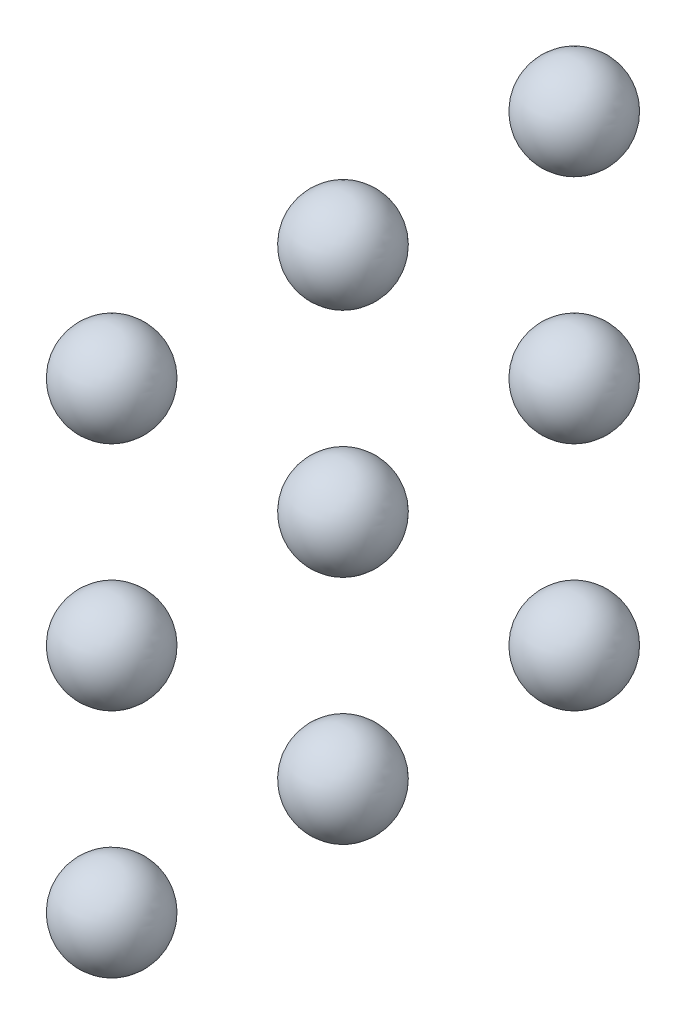
ISO-10303-21;
HEADER;
FILE_DESCRIPTION(('STEP AP214'),'2;1');
FILE_NAME('part.step','',(''),(''),'','','');
FILE_SCHEMA(('AUTOMOTIVE_DESIGN { 1 0 10303 214 1 1 1 1 }'));
ENDSEC;
DATA;
#1=APPLICATION_CONTEXT('core data for automotive mechanical design processes');
#2=APPLICATION_PROTOCOL_DEFINITION('international standard','automotive_design',2000,#1);
#3=PRODUCT_CONTEXT('',#1,'mechanical');
#4=PRODUCT('Part','Part','',(#3));
#5=PRODUCT_RELATED_PRODUCT_CATEGORY('part','',(#4));
#6=PRODUCT_DEFINITION_FORMATION('','',#4);
#7=PRODUCT_DEFINITION_CONTEXT('part definition',#1,'design');
#8=PRODUCT_DEFINITION('design','',#6,#7);
#9=PRODUCT_DEFINITION_SHAPE('','',#8);
#10=(LENGTH_UNIT() NAMED_UNIT(*) SI_UNIT(.MILLI.,.METRE.));
#11=(NAMED_UNIT(*) PLANE_ANGLE_UNIT() SI_UNIT($,.RADIAN.));
#12=(NAMED_UNIT(*) SI_UNIT($,.STERADIAN.) SOLID_ANGLE_UNIT());
#13=UNCERTAINTY_MEASURE_WITH_UNIT(LENGTH_MEASURE(1.E-05),#10,'distance_accuracy_value','');
#14=(GEOMETRIC_REPRESENTATION_CONTEXT(3) GLOBAL_UNCERTAINTY_ASSIGNED_CONTEXT((#13)) GLOBAL_UNIT_ASSIGNED_CONTEXT((#10,
#11,#12)) REPRESENTATION_CONTEXT('',''));
#15=CARTESIAN_POINT('',(0.,0.,0.));
#16=DIRECTION('',(0.,0.,1.));
#17=DIRECTION('',(1.,0.,0.));
#18=AXIS2_PLACEMENT_3D('',#15,#16,#17);
#19=CARTESIAN_POINT('',(0.,40.,40.));
#20=DIRECTION('',(0.,1.,0.));
#21=DIRECTION('',(1.,0.,0.));
#22=AXIS2_PLACEMENT_3D('',#19,#20,#21);
#23=SPHERICAL_SURFACE('',#22,4.);
#24=CARTESIAN_POINT('',(0.,44.,40.));
#25=VERTEX_POINT('',#24);
#26=VERTEX_LOOP('',#25);
#27=FACE_BOUND('',#26,.T.);
#28=ADVANCED_FACE('F39',(#27),#23,.T.);
#29=CLOSED_SHELL('',(#28));
#30=MANIFOLD_SOLID_BREP('B2',#29);
#31=CARTESIAN_POINT('',(0.,40.,20.));
#32=DIRECTION('',(0.,1.,0.));
#33=DIRECTION('',(1.,0.,0.));
#34=AXIS2_PLACEMENT_3D('',#31,#32,#33);
#35=SPHERICAL_SURFACE('',#34,4.);
#36=CARTESIAN_POINT('',(0.,44.,20.));
#37=VERTEX_POINT('',#36);
#38=VERTEX_LOOP('',#37);
#39=FACE_BOUND('',#38,.T.);
#40=ADVANCED_FACE('F57',(#39),#35,.T.);
#41=CLOSED_SHELL('',(#40));
#42=MANIFOLD_SOLID_BREP('B6',#41);
#43=CARTESIAN_POINT('',(0.,40.,0.));
#44=DIRECTION('',(0.,1.,0.));
#45=DIRECTION('',(1.,0.,0.));
#46=AXIS2_PLACEMENT_3D('',#43,#44,#45);
#47=SPHERICAL_SURFACE('',#46,4.);
#48=CARTESIAN_POINT('',(0.,44.,0.));
#49=VERTEX_POINT('',#48);
#50=VERTEX_LOOP('',#49);
#51=FACE_BOUND('',#50,.T.);
#52=ADVANCED_FACE('F75',(#51),#47,.T.);
#53=CLOSED_SHELL('',(#52));
#54=MANIFOLD_SOLID_BREP('B35',#53);
#55=CARTESIAN_POINT('',(0.,20.,40.));
#56=DIRECTION('',(0.,1.,0.));
#57=DIRECTION('',(1.,0.,0.));
#58=AXIS2_PLACEMENT_3D('',#55,#56,#57);
#59=SPHERICAL_SURFACE('',#58,4.);
#60=CARTESIAN_POINT('',(0.,24.,40.));
#61=VERTEX_POINT('',#60);
#62=VERTEX_LOOP('',#61);
#63=FACE_BOUND('',#62,.T.);
#64=ADVANCED_FACE('F93',(#63),#59,.T.);
#65=CLOSED_SHELL('',(#64));
#66=MANIFOLD_SOLID_BREP('B53',#65);
#67=CARTESIAN_POINT('',(0.,20.,20.));
#68=DIRECTION('',(0.,1.,0.));
#69=DIRECTION('',(1.,0.,0.));
#70=AXIS2_PLACEMENT_3D('',#67,#68,#69);
#71=SPHERICAL_SURFACE('',#70,4.);
#72=CARTESIAN_POINT('',(0.,24.,20.));
#73=VERTEX_POINT('',#72);
#74=VERTEX_LOOP('',#73);
#75=FACE_BOUND('',#74,.T.);
#76=ADVANCED_FACE('F111',(#75),#71,.T.);
#77=CLOSED_SHELL('',(#76));
#78=MANIFOLD_SOLID_BREP('B71',#77);
#79=CARTESIAN_POINT('',(0.,20.,0.));
#80=DIRECTION('',(0.,1.,0.));
#81=DIRECTION('',(1.,0.,0.));
#82=AXIS2_PLACEMENT_3D('',#79,#80,#81);
#83=SPHERICAL_SURFACE('',#82,4.);
#84=CARTESIAN_POINT('',(0.,24.,0.));
#85=VERTEX_POINT('',#84);
#86=VERTEX_LOOP('',#85);
#87=FACE_BOUND('',#86,.T.);
#88=ADVANCED_FACE('F129',(#87),#83,.T.);
#89=CLOSED_SHELL('',(#88));
#90=MANIFOLD_SOLID_BREP('B89',#89);
#91=CARTESIAN_POINT('',(0.,0.,40.));
#92=DIRECTION('',(0.,1.,0.));
#93=DIRECTION('',(1.,0.,0.));
#94=AXIS2_PLACEMENT_3D('',#91,#92,#93);
#95=SPHERICAL_SURFACE('',#94,4.);
#96=CARTESIAN_POINT('',(0.,4.,40.));
#97=VERTEX_POINT('',#96);
#98=VERTEX_LOOP('',#97);
#99=FACE_BOUND('',#98,.T.);
#100=ADVANCED_FACE('F147',(#99),#95,.T.);
#101=CLOSED_SHELL('',(#100));
#102=MANIFOLD_SOLID_BREP('B107',#101);
#103=CARTESIAN_POINT('',(0.,0.,20.));
#104=DIRECTION('',(0.,1.,0.));
#105=DIRECTION('',(1.,0.,0.));
#106=AXIS2_PLACEMENT_3D('',#103,#104,#105);
#107=SPHERICAL_SURFACE('',#106,4.);
#108=CARTESIAN_POINT('',(0.,4.,20.));
#109=VERTEX_POINT('',#108);
#110=VERTEX_LOOP('',#109);
#111=FACE_BOUND('',#110,.T.);
#112=ADVANCED_FACE('F164',(#111),#107,.T.);
#113=CLOSED_SHELL('',(#112));
#114=MANIFOLD_SOLID_BREP('B125',#113);
#115=CARTESIAN_POINT('',(0.,0.,0.));
#116=DIRECTION('',(0.,1.,0.));
#117=DIRECTION('',(1.,0.,0.));
#118=AXIS2_PLACEMENT_3D('',#115,#116,#117);
#119=SPHERICAL_SURFACE('',#118,4.);
#120=CARTESIAN_POINT('',(0.,4.,0.));
#121=VERTEX_POINT('',#120);
#122=VERTEX_LOOP('',#121);
#123=FACE_BOUND('',#122,.T.);
#124=ADVANCED_FACE('F176',(#123),#119,.T.);
#125=CLOSED_SHELL('',(#124));
#126=MANIFOLD_SOLID_BREP('B143',#125);
#127=ADVANCED_BREP_SHAPE_REPRESENTATION('',(#18,#30,#42,#54,#66,#78,#90,#102,#114,#126),#14);
#128=SHAPE_DEFINITION_REPRESENTATION(#9,#127);
ENDSEC;
END-ISO-10303-21;
